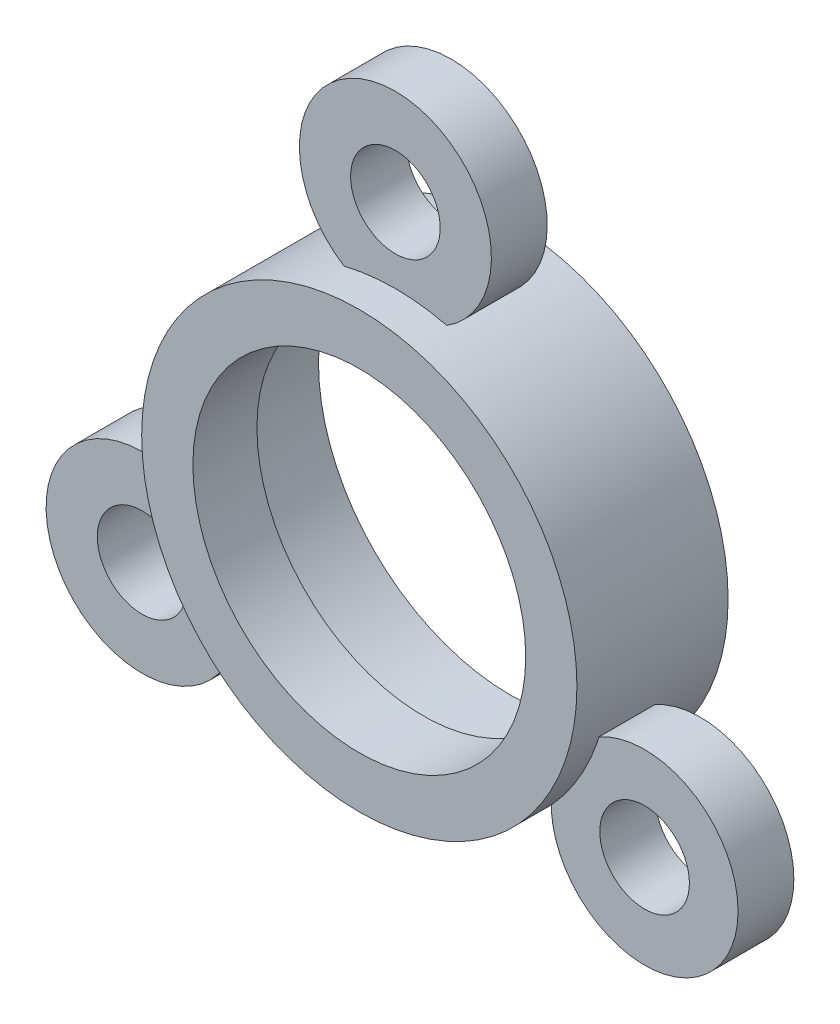
ISO-10303-21;
HEADER;
FILE_DESCRIPTION(('STEP AP214'),'2;1');
FILE_NAME('part.step','',(''),(''),'','','');
FILE_SCHEMA(('AUTOMOTIVE_DESIGN { 1 0 10303 214 1 1 1 1 }'));
ENDSEC;
DATA;
#1=APPLICATION_CONTEXT('core data for automotive mechanical design processes');
#2=APPLICATION_PROTOCOL_DEFINITION('international standard','automotive_design',2000,#1);
#3=PRODUCT_CONTEXT('',#1,'mechanical');
#4=PRODUCT('Part','Part','',(#3));
#5=PRODUCT_RELATED_PRODUCT_CATEGORY('part','',(#4));
#6=PRODUCT_DEFINITION_FORMATION('','',#4);
#7=PRODUCT_DEFINITION_CONTEXT('part definition',#1,'design');
#8=PRODUCT_DEFINITION('design','',#6,#7);
#9=PRODUCT_DEFINITION_SHAPE('','',#8);
#10=(LENGTH_UNIT() NAMED_UNIT(*) SI_UNIT(.MILLI.,.METRE.));
#11=(NAMED_UNIT(*) PLANE_ANGLE_UNIT() SI_UNIT($,.RADIAN.));
#12=(NAMED_UNIT(*) SI_UNIT($,.STERADIAN.) SOLID_ANGLE_UNIT());
#13=UNCERTAINTY_MEASURE_WITH_UNIT(LENGTH_MEASURE(1.E-05),#10,'distance_accuracy_value','');
#14=(GEOMETRIC_REPRESENTATION_CONTEXT(3) GLOBAL_UNCERTAINTY_ASSIGNED_CONTEXT((#13)) GLOBAL_UNIT_ASSIGNED_CONTEXT((#10,
#11,#12)) REPRESENTATION_CONTEXT('',''));
#15=CARTESIAN_POINT('',(0.,0.,0.));
#16=DIRECTION('',(0.,0.,1.));
#17=DIRECTION('',(1.,0.,0.));
#18=AXIS2_PLACEMENT_3D('',#15,#16,#17);
#19=CARTESIAN_POINT('',(9.89394912221465,-5.71227418905909,-2.18));
#20=DIRECTION('',(0.,0.,1.));
#21=DIRECTION('',(1.,0.,0.));
#22=AXIS2_PLACEMENT_3D('',#19,#20,#21);
#23=CYLINDRICAL_SURFACE('',#22,3.65);
#24=CARTESIAN_POINT('',(9.89394912221465,-5.71227418905909,-2.18));
#25=DIRECTION('',(0.,0.,1.));
#26=DIRECTION('',(1.,0.,0.));
#27=AXIS2_PLACEMENT_3D('',#24,#25,#26);
#28=CIRCLE('',#27,3.65);
#29=CARTESIAN_POINT('',(13.5439491222147,-5.71227418905909,-2.18));
#30=VERTEX_POINT('',#29);
#31=EDGE_CURVE('E12',#30,#30,#28,.T.);
#32=ORIENTED_EDGE('',*,*,#31,.T.);
#33=EDGE_LOOP('',(#32));
#34=FACE_BOUND('',#33,.T.);
#35=CARTESIAN_POINT('',(9.89394912221465,-5.71227418905909,0.0001));
#36=DIRECTION('',(0.,0.,1.));
#37=DIRECTION('',(1.,0.,0.));
#38=AXIS2_PLACEMENT_3D('',#35,#36,#37);
#39=CIRCLE('',#38,3.65);
#40=CARTESIAN_POINT('',(13.5439491222147,-5.71227418905909,0.0001));
#41=VERTEX_POINT('',#40);
#42=EDGE_CURVE('E93',#41,#41,#39,.T.);
#43=ORIENTED_EDGE('',*,*,#42,.F.);
#44=EDGE_LOOP('',(#43));
#45=FACE_BOUND('',#44,.T.);
#46=ADVANCED_FACE('F83',(#34,#45),#23,.T.);
#47=CARTESIAN_POINT('',(9.89394912221465,-5.71227418905909,-2.18));
#48=DIRECTION('',(0.,0.,1.));
#49=DIRECTION('',(1.,0.,0.));
#50=AXIS2_PLACEMENT_3D('',#47,#48,#49);
#51=PLANE('',#50);
#52=CARTESIAN_POINT('',(9.89394912221465,-5.71227418905909,-2.18));
#53=DIRECTION('',(0.,0.,1.));
#54=DIRECTION('',(1.,0.,0.));
#55=AXIS2_PLACEMENT_3D('',#52,#53,#54);
#56=CIRCLE('',#55,1.75);
#57=CARTESIAN_POINT('',(11.6439491222147,-5.71227418905909,-2.18));
#58=VERTEX_POINT('',#57);
#59=EDGE_CURVE('E89',#58,#58,#56,.T.);
#60=ORIENTED_EDGE('',*,*,#59,.T.);
#61=EDGE_LOOP('',(#60));
#62=FACE_BOUND('',#61,.T.);
#63=ORIENTED_EDGE('',*,*,#31,.F.);
#64=EDGE_LOOP('',(#63));
#65=FACE_BOUND('',#64,.T.);
#66=ADVANCED_FACE('F112',(#62,#65),#51,.F.);
#67=CARTESIAN_POINT('',(9.89394912221465,-5.71227418905909,-2.18));
#68=DIRECTION('',(0.,0.,1.));
#69=DIRECTION('',(1.,0.,0.));
#70=AXIS2_PLACEMENT_3D('',#67,#68,#69);
#71=CYLINDRICAL_SURFACE('',#70,1.75);
#72=ORIENTED_EDGE('',*,*,#59,.F.);
#73=EDGE_LOOP('',(#72));
#74=FACE_BOUND('',#73,.T.);
#75=CARTESIAN_POINT('',(9.89394912221465,-5.71227418905909,0.0001));
#76=DIRECTION('',(0.,0.,1.));
#77=DIRECTION('',(1.,0.,0.));
#78=AXIS2_PLACEMENT_3D('',#75,#76,#77);
#79=CIRCLE('',#78,1.75);
#80=CARTESIAN_POINT('',(11.6439491222147,-5.71227418905909,0.0001));
#81=VERTEX_POINT('',#80);
#82=EDGE_CURVE('E97',#81,#81,#79,.T.);
#83=ORIENTED_EDGE('',*,*,#82,.T.);
#84=EDGE_LOOP('',(#83));
#85=FACE_BOUND('',#84,.T.);
#86=ADVANCED_FACE('F103',(#74,#85),#71,.F.);
#87=CARTESIAN_POINT('',(9.89394912221465,-5.71227418905909,0.0001));
#88=DIRECTION('',(0.,0.,1.));
#89=DIRECTION('',(1.,0.,0.));
#90=AXIS2_PLACEMENT_3D('',#87,#88,#89);
#91=PLANE('',#90);
#92=ORIENTED_EDGE('',*,*,#42,.T.);
#93=EDGE_LOOP('',(#92));
#94=FACE_BOUND('',#93,.T.);
#95=ORIENTED_EDGE('',*,*,#82,.F.);
#96=EDGE_LOOP('',(#95));
#97=FACE_BOUND('',#96,.T.);
#98=ADVANCED_FACE('F105',(#94,#97),#91,.T.);
#99=CLOSED_SHELL('',(#46,#66,#86,#98));
#100=MANIFOLD_SOLID_BREP('B2',#99);
#101=CARTESIAN_POINT('',(0.,0.,-10.8356319652718));
#102=DIRECTION('',(0.,0.,1.));
#103=DIRECTION('',(1.,0.,0.));
#104=AXIS2_PLACEMENT_3D('',#101,#102,#103);
#105=CYLINDRICAL_SURFACE('',#104,8.5);
#106=CARTESIAN_POINT('',(0.,0.,1.25));
#107=DIRECTION('',(0.,0.,1.));
#108=DIRECTION('',(1.,0.,0.));
#109=AXIS2_PLACEMENT_3D('',#106,#107,#108);
#110=CIRCLE('',#109,8.5);
#111=CARTESIAN_POINT('',(8.5,0.,1.25));
#112=VERTEX_POINT('',#111);
#113=EDGE_CURVE('E234',#112,#112,#110,.T.);
#114=ORIENTED_EDGE('',*,*,#113,.F.);
#115=EDGE_LOOP('',(#114));
#116=FACE_BOUND('',#115,.T.);
#117=CARTESIAN_POINT('',(0.,0.,-4.65563196527182));
#118=DIRECTION('',(0.,0.,-1.));
#119=DIRECTION('',(-1.,0.,0.));
#120=AXIS2_PLACEMENT_3D('',#117,#118,#119);
#121=CIRCLE('',#120,8.5);
#122=CARTESIAN_POINT('',(-8.5,0.,-4.65563196527182));
#123=VERTEX_POINT('',#122);
#124=EDGE_CURVE('E226',#123,#123,#121,.T.);
#125=ORIENTED_EDGE('',*,*,#124,.F.);
#126=EDGE_LOOP('',(#125));
#127=FACE_BOUND('',#126,.T.);
#128=DIRECTION('',(0.,0.,-1.));
#129=VECTOR('',#128,1.);
#130=CARTESIAN_POINT('',(-8.1575069410236,-2.38853103541733,-1.25));
#131=LINE('',#130,#129);
#132=CARTESIAN_POINT('',(-8.1575069410236,-2.38853103541733,-0.16));
#133=VERTEX_POINT('',#132);
#134=CARTESIAN_POINT('',(-8.1575069410236,-2.38853103541733,-2.34));
#135=VERTEX_POINT('',#134);
#136=EDGE_CURVE('E254',#133,#135,#131,.T.);
#137=ORIENTED_EDGE('',*,*,#136,.F.);
#138=CARTESIAN_POINT('',(0.,0.,-0.16));
#139=DIRECTION('',(0.,0.,-1.));
#140=DIRECTION('',(-1.,0.,0.));
#141=AXIS2_PLACEMENT_3D('',#138,#139,#140);
#142=CIRCLE('',#141,8.5);
#143=CARTESIAN_POINT('',(-6.14728202491075,-5.87034272476566,-0.16));
#144=VERTEX_POINT('',#143);
#145=EDGE_CURVE('E193',#133,#144,#142,.F.);
#146=ORIENTED_EDGE('',*,*,#145,.T.);
#147=DIRECTION('',(0.,0.,-1.));
#148=VECTOR('',#147,1.);
#149=CARTESIAN_POINT('',(-6.14728202491075,-5.87034272476566,-1.25));
#150=LINE('',#149,#148);
#151=CARTESIAN_POINT('',(-6.14728202491075,-5.87034272476567,-2.34));
#152=VERTEX_POINT('',#151);
#153=EDGE_CURVE('E258',#152,#144,#150,.F.);
#154=ORIENTED_EDGE('',*,*,#153,.F.);
#155=CARTESIAN_POINT('',(0.,0.,-2.34));
#156=DIRECTION('',(0.,0.,-1.));
#157=DIRECTION('',(-1.,0.,0.));
#158=AXIS2_PLACEMENT_3D('',#155,#156,#157);
#159=CIRCLE('',#158,8.5);
#160=EDGE_CURVE('E250',#135,#152,#159,.F.);
#161=ORIENTED_EDGE('',*,*,#160,.F.);
#162=EDGE_LOOP('',(#137,#146,#154,#161));
#163=FACE_BOUND('',#162,.T.);
#164=DIRECTION('',(0.,0.,-1.));
#165=VECTOR('',#164,1.);
#166=CARTESIAN_POINT('',(2.01022491611285,8.25887376018299,-1.25));
#167=LINE('',#166,#165);
#168=CARTESIAN_POINT('',(2.01022491611285,8.25887376018299,-0.16));
#169=VERTEX_POINT('',#168);
#170=CARTESIAN_POINT('',(2.01022491611284,8.25887376018299,-2.34));
#171=VERTEX_POINT('',#170);
#172=EDGE_CURVE('E164',#169,#171,#167,.T.);
#173=ORIENTED_EDGE('',*,*,#172,.F.);
#174=CARTESIAN_POINT('',(0.,0.,-0.16));
#175=DIRECTION('',(0.,0.,-1.));
#176=DIRECTION('',(-1.,0.,0.));
#177=AXIS2_PLACEMENT_3D('',#174,#175,#176);
#178=CIRCLE('',#177,8.5);
#179=CARTESIAN_POINT('',(-2.01022491611285,8.25887376018299,-0.16));
#180=VERTEX_POINT('',#179);
#181=EDGE_CURVE('E81',#169,#180,#178,.F.);
#182=ORIENTED_EDGE('',*,*,#181,.T.);
#183=DIRECTION('',(0.,0.,-1.));
#184=VECTOR('',#183,1.);
#185=CARTESIAN_POINT('',(-2.01022491611285,8.25887376018299,-1.25));
#186=LINE('',#185,#184);
#187=CARTESIAN_POINT('',(-2.01022491611284,8.25887376018299,-2.34));
#188=VERTEX_POINT('',#187);
#189=EDGE_CURVE('E154',#188,#180,#186,.F.);
#190=ORIENTED_EDGE('',*,*,#189,.F.);
#191=CARTESIAN_POINT('',(0.,0.,-2.34));
#192=DIRECTION('',(0.,0.,-1.));
#193=DIRECTION('',(-1.,0.,0.));
#194=AXIS2_PLACEMENT_3D('',#191,#192,#193);
#195=CIRCLE('',#194,8.5);
#196=EDGE_CURVE('E181',#171,#188,#195,.F.);
#197=ORIENTED_EDGE('',*,*,#196,.F.);
#198=EDGE_LOOP('',(#173,#182,#190,#197));
#199=FACE_BOUND('',#198,.T.);
#200=ADVANCED_FACE('F145',(#116,#127,#163,#199),#105,.T.);
#201=CARTESIAN_POINT('',(0.,0.,-1.25));
#202=DIRECTION('',(0.,0.,1.));
#203=DIRECTION('',(1.,0.,0.));
#204=AXIS2_PLACEMENT_3D('',#201,#202,#203);
#205=CYLINDRICAL_SURFACE('',#204,7.5);
#206=CARTESIAN_POINT('',(0.,0.,-1.25));
#207=DIRECTION('',(0.,0.,1.));
#208=DIRECTION('',(1.,0.,0.));
#209=AXIS2_PLACEMENT_3D('',#206,#207,#208);
#210=CIRCLE('',#209,7.5);
#211=CARTESIAN_POINT('',(7.5,0.,-1.25));
#212=VERTEX_POINT('',#211);
#213=EDGE_CURVE('E246',#212,#212,#210,.T.);
#214=ORIENTED_EDGE('',*,*,#213,.T.);
#215=EDGE_LOOP('',(#214));
#216=FACE_BOUND('',#215,.T.);
#217=CARTESIAN_POINT('',(0.,0.,-4.65563196527182));
#218=DIRECTION('',(0.,0.,-1.));
#219=DIRECTION('',(-1.,0.,0.));
#220=AXIS2_PLACEMENT_3D('',#217,#218,#219);
#221=CIRCLE('',#220,7.5);
#222=CARTESIAN_POINT('',(-7.5,0.,-4.65563196527182));
#223=VERTEX_POINT('',#222);
#224=EDGE_CURVE('E230',#223,#223,#221,.F.);
#225=ORIENTED_EDGE('',*,*,#224,.F.);
#226=EDGE_LOOP('',(#225));
#227=FACE_BOUND('',#226,.T.);
#228=ADVANCED_FACE('F294',(#216,#227),#205,.F.);
#229=CARTESIAN_POINT('',(0.,0.,-1.25));
#230=DIRECTION('',(0.,0.,1.));
#231=DIRECTION('',(1.,0.,0.));
#232=AXIS2_PLACEMENT_3D('',#229,#230,#231);
#233=PLANE('',#232);
#234=CARTESIAN_POINT('',(0.,0.,-1.25));
#235=DIRECTION('',(0.,0.,1.));
#236=DIRECTION('',(1.,0.,0.));
#237=AXIS2_PLACEMENT_3D('',#234,#235,#236);
#238=CIRCLE('',#237,6.5);
#239=CARTESIAN_POINT('',(6.5,0.,-1.25));
#240=VERTEX_POINT('',#239);
#241=EDGE_CURVE('E242',#240,#240,#238,.T.);
#242=ORIENTED_EDGE('',*,*,#241,.T.);
#243=EDGE_LOOP('',(#242));
#244=FACE_BOUND('',#243,.T.);
#245=ORIENTED_EDGE('',*,*,#213,.F.);
#246=EDGE_LOOP('',(#245));
#247=FACE_BOUND('',#246,.T.);
#248=ADVANCED_FACE('F147',(#244,#247),#233,.F.);
#249=CARTESIAN_POINT('',(0.,0.,-1.25));
#250=DIRECTION('',(0.,0.,1.));
#251=DIRECTION('',(1.,0.,0.));
#252=AXIS2_PLACEMENT_3D('',#249,#250,#251);
#253=CYLINDRICAL_SURFACE('',#252,6.5);
#254=ORIENTED_EDGE('',*,*,#241,.F.);
#255=EDGE_LOOP('',(#254));
#256=FACE_BOUND('',#255,.T.);
#257=CARTESIAN_POINT('',(0.,0.,1.25));
#258=DIRECTION('',(0.,0.,1.));
#259=DIRECTION('',(1.,0.,0.));
#260=AXIS2_PLACEMENT_3D('',#257,#258,#259);
#261=CIRCLE('',#260,6.5);
#262=CARTESIAN_POINT('',(6.5,0.,1.25));
#263=VERTEX_POINT('',#262);
#264=EDGE_CURVE('E238',#263,#263,#261,.T.);
#265=ORIENTED_EDGE('',*,*,#264,.T.);
#266=EDGE_LOOP('',(#265));
#267=FACE_BOUND('',#266,.T.);
#268=ADVANCED_FACE('F310',(#256,#267),#253,.F.);
#269=CARTESIAN_POINT('',(0.,0.,1.25));
#270=DIRECTION('',(0.,0.,1.));
#271=DIRECTION('',(1.,0.,0.));
#272=AXIS2_PLACEMENT_3D('',#269,#270,#271);
#273=PLANE('',#272);
#274=ORIENTED_EDGE('',*,*,#264,.F.);
#275=EDGE_LOOP('',(#274));
#276=FACE_BOUND('',#275,.T.);
#277=ORIENTED_EDGE('',*,*,#113,.T.);
#278=EDGE_LOOP('',(#277));
#279=FACE_BOUND('',#278,.T.);
#280=ADVANCED_FACE('F308',(#276,#279),#273,.T.);
#281=CARTESIAN_POINT('',(0.,0.,-4.65563196527182));
#282=DIRECTION('',(0.,0.,-1.));
#283=DIRECTION('',(-1.,0.,0.));
#284=AXIS2_PLACEMENT_3D('',#281,#282,#283);
#285=PLANE('',#284);
#286=ORIENTED_EDGE('',*,*,#124,.T.);
#287=EDGE_LOOP('',(#286));
#288=FACE_BOUND('',#287,.T.);
#289=ORIENTED_EDGE('',*,*,#224,.T.);
#290=EDGE_LOOP('',(#289));
#291=FACE_BOUND('',#290,.T.);
#292=ADVANCED_FACE('F305',(#288,#291),#285,.T.);
#293=CARTESIAN_POINT('',(-9.89394912221465,-5.71227418905909,-0.16));
#294=DIRECTION('',(0.,0.,-1.));
#295=DIRECTION('',(-1.,0.,0.));
#296=AXIS2_PLACEMENT_3D('',#293,#294,#295);
#297=CYLINDRICAL_SURFACE('',#296,3.75);
#298=CARTESIAN_POINT('',(-9.89394912221465,-5.71227418905909,-2.34));
#299=DIRECTION('',(0.,0.,-1.));
#300=DIRECTION('',(-1.,0.,0.));
#301=AXIS2_PLACEMENT_3D('',#298,#299,#300);
#302=CIRCLE('',#301,3.75);
#303=EDGE_CURVE('E214',#152,#135,#302,.T.);
#304=ORIENTED_EDGE('',*,*,#303,.F.);
#305=ORIENTED_EDGE('',*,*,#153,.T.);
#306=CARTESIAN_POINT('',(-9.89394912221465,-5.71227418905909,-0.16));
#307=DIRECTION('',(0.,0.,-1.));
#308=DIRECTION('',(-1.,0.,0.));
#309=AXIS2_PLACEMENT_3D('',#306,#307,#308);
#310=CIRCLE('',#309,3.75);
#311=EDGE_CURVE('E222',#144,#133,#310,.T.);
#312=ORIENTED_EDGE('',*,*,#311,.T.);
#313=ORIENTED_EDGE('',*,*,#136,.T.);
#314=EDGE_LOOP('',(#304,#305,#312,#313));
#315=FACE_BOUND('',#314,.T.);
#316=ADVANCED_FACE('F271',(#315),#297,.T.);
#317=CARTESIAN_POINT('',(-9.89394912221465,-5.71227418905909,-0.16));
#318=DIRECTION('',(0.,0.,-1.));
#319=DIRECTION('',(-1.,0.,0.));
#320=AXIS2_PLACEMENT_3D('',#317,#318,#319);
#321=PLANE('',#320);
#322=ORIENTED_EDGE('',*,*,#145,.F.);
#323=ORIENTED_EDGE('',*,*,#311,.F.);
#324=EDGE_LOOP('',(#322,#323));
#325=FACE_BOUND('',#324,.T.);
#326=CARTESIAN_POINT('',(-9.89394912221465,-5.71227418905909,-0.16));
#327=DIRECTION('',(0.,0.,-1.));
#328=DIRECTION('',(-1.,0.,0.));
#329=AXIS2_PLACEMENT_3D('',#326,#327,#328);
#330=CIRCLE('',#329,1.75);
#331=CARTESIAN_POINT('',(-11.6439491222147,-5.71227418905909,-0.16));
#332=VERTEX_POINT('',#331);
#333=EDGE_CURVE('E218',#332,#332,#330,.T.);
#334=ORIENTED_EDGE('',*,*,#333,.T.);
#335=EDGE_LOOP('',(#334));
#336=FACE_BOUND('',#335,.T.);
#337=ADVANCED_FACE('F272',(#325,#336),#321,.F.);
#338=CARTESIAN_POINT('',(-9.89394912221465,-5.71227418905909,-0.16));
#339=DIRECTION('',(0.,0.,-1.));
#340=DIRECTION('',(-1.,0.,0.));
#341=AXIS2_PLACEMENT_3D('',#338,#339,#340);
#342=CYLINDRICAL_SURFACE('',#341,1.75);
#343=ORIENTED_EDGE('',*,*,#333,.F.);
#344=EDGE_LOOP('',(#343));
#345=FACE_BOUND('',#344,.T.);
#346=CARTESIAN_POINT('',(-9.89394912221465,-5.71227418905909,-2.34));
#347=DIRECTION('',(0.,0.,-1.));
#348=DIRECTION('',(-1.,0.,0.));
#349=AXIS2_PLACEMENT_3D('',#346,#347,#348);
#350=CIRCLE('',#349,1.75);
#351=CARTESIAN_POINT('',(-11.6439491222147,-5.71227418905909,-2.34));
#352=VERTEX_POINT('',#351);
#353=EDGE_CURVE('E210',#352,#352,#350,.T.);
#354=ORIENTED_EDGE('',*,*,#353,.T.);
#355=EDGE_LOOP('',(#354));
#356=FACE_BOUND('',#355,.T.);
#357=ADVANCED_FACE('F275',(#345,#356),#342,.F.);
#358=CARTESIAN_POINT('',(-9.89394912221465,-5.71227418905909,-2.34));
#359=DIRECTION('',(0.,0.,-1.));
#360=DIRECTION('',(-1.,0.,0.));
#361=AXIS2_PLACEMENT_3D('',#358,#359,#360);
#362=PLANE('',#361);
#363=ORIENTED_EDGE('',*,*,#303,.T.);
#364=ORIENTED_EDGE('',*,*,#160,.T.);
#365=EDGE_LOOP('',(#363,#364));
#366=FACE_BOUND('',#365,.T.);
#367=ORIENTED_EDGE('',*,*,#353,.F.);
#368=EDGE_LOOP('',(#367));
#369=FACE_BOUND('',#368,.T.);
#370=ADVANCED_FACE('F281',(#366,#369),#362,.T.);
#371=CARTESIAN_POINT('',(0.,11.4245483781182,-0.16));
#372=DIRECTION('',(0.,0.,-1.));
#373=DIRECTION('',(-1.,0.,0.));
#374=AXIS2_PLACEMENT_3D('',#371,#372,#373);
#375=CYLINDRICAL_SURFACE('',#374,3.75);
#376=CARTESIAN_POINT('',(0.,11.4245483781182,-2.34));
#377=DIRECTION('',(0.,0.,-1.));
#378=DIRECTION('',(-1.,0.,0.));
#379=AXIS2_PLACEMENT_3D('',#376,#377,#378);
#380=CIRCLE('',#379,3.75);
#381=EDGE_CURVE('E191',#188,#171,#380,.T.);
#382=ORIENTED_EDGE('',*,*,#381,.F.);
#383=ORIENTED_EDGE('',*,*,#189,.T.);
#384=CARTESIAN_POINT('',(0.,11.4245483781182,-0.16));
#385=DIRECTION('',(0.,0.,-1.));
#386=DIRECTION('',(-1.,0.,0.));
#387=AXIS2_PLACEMENT_3D('',#384,#385,#386);
#388=CIRCLE('',#387,3.75);
#389=EDGE_CURVE('E203',#180,#169,#388,.T.);
#390=ORIENTED_EDGE('',*,*,#389,.T.);
#391=ORIENTED_EDGE('',*,*,#172,.T.);
#392=EDGE_LOOP('',(#382,#383,#390,#391));
#393=FACE_BOUND('',#392,.T.);
#394=ADVANCED_FACE('F195',(#393),#375,.T.);
#395=CARTESIAN_POINT('',(0.,11.4245483781182,-0.16));
#396=DIRECTION('',(0.,0.,-1.));
#397=DIRECTION('',(-1.,0.,0.));
#398=AXIS2_PLACEMENT_3D('',#395,#396,#397);
#399=PLANE('',#398);
#400=ORIENTED_EDGE('',*,*,#181,.F.);
#401=ORIENTED_EDGE('',*,*,#389,.F.);
#402=EDGE_LOOP('',(#400,#401));
#403=FACE_BOUND('',#402,.T.);
#404=CARTESIAN_POINT('',(0.,11.4245483781182,-0.16));
#405=DIRECTION('',(0.,0.,-1.));
#406=DIRECTION('',(-1.,0.,0.));
#407=AXIS2_PLACEMENT_3D('',#404,#405,#406);
#408=CIRCLE('',#407,1.75);
#409=CARTESIAN_POINT('',(-1.75,11.4245483781182,-0.16));
#410=VERTEX_POINT('',#409);
#411=EDGE_CURVE('E197',#410,#410,#408,.T.);
#412=ORIENTED_EDGE('',*,*,#411,.T.);
#413=EDGE_LOOP('',(#412));
#414=FACE_BOUND('',#413,.T.);
#415=ADVANCED_FACE('F291',(#403,#414),#399,.F.);
#416=CARTESIAN_POINT('',(0.,11.4245483781182,-0.16));
#417=DIRECTION('',(0.,0.,-1.));
#418=DIRECTION('',(-1.,0.,0.));
#419=AXIS2_PLACEMENT_3D('',#416,#417,#418);
#420=CYLINDRICAL_SURFACE('',#419,1.75);
#421=ORIENTED_EDGE('',*,*,#411,.F.);
#422=EDGE_LOOP('',(#421));
#423=FACE_BOUND('',#422,.T.);
#424=CARTESIAN_POINT('',(0.,11.4245483781182,-2.34));
#425=DIRECTION('',(0.,0.,-1.));
#426=DIRECTION('',(-1.,0.,0.));
#427=AXIS2_PLACEMENT_3D('',#424,#425,#426);
#428=CIRCLE('',#427,1.75);
#429=CARTESIAN_POINT('',(-1.75,11.4245483781182,-2.34));
#430=VERTEX_POINT('',#429);
#431=EDGE_CURVE('E198',#430,#430,#428,.T.);
#432=ORIENTED_EDGE('',*,*,#431,.T.);
#433=EDGE_LOOP('',(#432));
#434=FACE_BOUND('',#433,.T.);
#435=ADVANCED_FACE('F366',(#423,#434),#420,.F.);
#436=CARTESIAN_POINT('',(0.,11.4245483781182,-2.34));
#437=DIRECTION('',(0.,0.,-1.));
#438=DIRECTION('',(-1.,0.,0.));
#439=AXIS2_PLACEMENT_3D('',#436,#437,#438);
#440=PLANE('',#439);
#441=ORIENTED_EDGE('',*,*,#381,.T.);
#442=ORIENTED_EDGE('',*,*,#196,.T.);
#443=EDGE_LOOP('',(#441,#442));
#444=FACE_BOUND('',#443,.T.);
#445=ORIENTED_EDGE('',*,*,#431,.F.);
#446=EDGE_LOOP('',(#445));
#447=FACE_BOUND('',#446,.T.);
#448=ADVANCED_FACE('F189',(#444,#447),#440,.T.);
#449=CLOSED_SHELL('',(#200,#228,#248,#268,#280,#292,#316,#337,#357,#370,#394,#415,#435,#448));
#450=MANIFOLD_SOLID_BREP('B7',#449);
#451=ADVANCED_BREP_SHAPE_REPRESENTATION('',(#18,#100,#450),#14);
#452=SHAPE_DEFINITION_REPRESENTATION(#9,#451);
ENDSEC;
END-ISO-10303-21;
